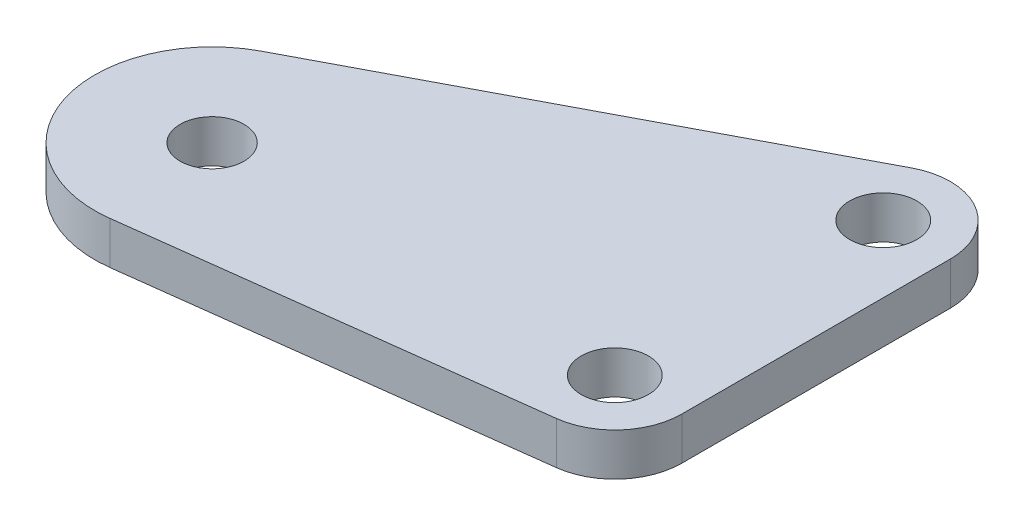
ISO-10303-21;
HEADER;
FILE_DESCRIPTION(('STEP AP214'),'2;1');
FILE_NAME('part.step','',(''),(''),'','','');
FILE_SCHEMA(('AUTOMOTIVE_DESIGN { 1 0 10303 214 1 1 1 1 }'));
ENDSEC;
DATA;
#1=APPLICATION_CONTEXT('core data for automotive mechanical design processes');
#2=APPLICATION_PROTOCOL_DEFINITION('international standard','automotive_design',2000,#1);
#3=PRODUCT_CONTEXT('',#1,'mechanical');
#4=PRODUCT('Part','Part','',(#3));
#5=PRODUCT_RELATED_PRODUCT_CATEGORY('part','',(#4));
#6=PRODUCT_DEFINITION_FORMATION('','',#4);
#7=PRODUCT_DEFINITION_CONTEXT('part definition',#1,'design');
#8=PRODUCT_DEFINITION('design','',#6,#7);
#9=PRODUCT_DEFINITION_SHAPE('','',#8);
#10=(LENGTH_UNIT() NAMED_UNIT(*) SI_UNIT(.MILLI.,.METRE.));
#11=(NAMED_UNIT(*) PLANE_ANGLE_UNIT() SI_UNIT($,.RADIAN.));
#12=(NAMED_UNIT(*) SI_UNIT($,.STERADIAN.) SOLID_ANGLE_UNIT());
#13=UNCERTAINTY_MEASURE_WITH_UNIT(LENGTH_MEASURE(1.E-05),#10,'distance_accuracy_value','');
#14=(GEOMETRIC_REPRESENTATION_CONTEXT(3) GLOBAL_UNCERTAINTY_ASSIGNED_CONTEXT((#13)) GLOBAL_UNIT_ASSIGNED_CONTEXT((#10,
#11,#12)) REPRESENTATION_CONTEXT('',''));
#15=CARTESIAN_POINT('',(0.,0.,0.));
#16=DIRECTION('',(0.,0.,1.));
#17=DIRECTION('',(1.,0.,0.));
#18=AXIS2_PLACEMENT_3D('',#15,#16,#17);
#19=CARTESIAN_POINT('',(0.,-6.35,-40.));
#20=DIRECTION('',(0.,1.,0.));
#21=DIRECTION('',(0.,0.,1.));
#22=AXIS2_PLACEMENT_3D('',#19,#20,#21);
#23=CYLINDRICAL_SURFACE('',#22,10.);
#24=CARTESIAN_POINT('',(0.,0.,-40.));
#25=DIRECTION('',(0.,1.,0.));
#26=DIRECTION('',(0.,0.,-1.));
#27=AXIS2_PLACEMENT_3D('',#24,#25,#26);
#28=CIRCLE('',#27,10.);
#29=CARTESIAN_POINT('',(10.,0.,-40.));
#30=VERTEX_POINT('',#29);
#31=CARTESIAN_POINT('',(-4.65153395683887,0.,-48.8523009352583));
#32=VERTEX_POINT('',#31);
#33=EDGE_CURVE('E130',#30,#32,#28,.T.);
#34=ORIENTED_EDGE('',*,*,#33,.F.);
#35=DIRECTION('',(0.,1.,0.));
#36=VECTOR('',#35,1.);
#37=CARTESIAN_POINT('',(10.,-6.35,-40.));
#38=LINE('',#37,#36);
#39=CARTESIAN_POINT('',(10.,-6.35,-40.));
#40=VERTEX_POINT('',#39);
#41=EDGE_CURVE('E11',#40,#30,#38,.T.);
#42=ORIENTED_EDGE('',*,*,#41,.F.);
#43=CARTESIAN_POINT('',(0.,-6.35,-40.));
#44=DIRECTION('',(0.,1.,0.));
#45=DIRECTION('',(0.,0.,-1.));
#46=AXIS2_PLACEMENT_3D('',#43,#44,#45);
#47=CIRCLE('',#46,10.);
#48=CARTESIAN_POINT('',(-4.65153395683887,-6.35,-48.8523009352583));
#49=VERTEX_POINT('',#48);
#50=EDGE_CURVE('E151',#40,#49,#47,.T.);
#51=ORIENTED_EDGE('',*,*,#50,.T.);
#52=DIRECTION('',(0.,1.,0.));
#53=VECTOR('',#52,1.);
#54=CARTESIAN_POINT('',(-4.65153395683887,-6.35,-48.8523009352583));
#55=LINE('',#54,#53);
#56=EDGE_CURVE('E42',#49,#32,#55,.T.);
#57=ORIENTED_EDGE('',*,*,#56,.T.);
#58=EDGE_LOOP('',(#34,#42,#51,#57));
#59=FACE_BOUND('',#58,.T.);
#60=ADVANCED_FACE('F39',(#59),#23,.T.);
#61=CARTESIAN_POINT('',(10.,-6.35,-40.));
#62=DIRECTION('',(1.,0.,0.));
#63=DIRECTION('',(0.,0.,-1.));
#64=AXIS2_PLACEMENT_3D('',#61,#62,#63);
#65=PLANE('',#64);
#66=DIRECTION('',(0.,0.,-1.));
#67=VECTOR('',#66,1.);
#68=CARTESIAN_POINT('',(10.,0.,-40.));
#69=LINE('',#68,#67);
#70=CARTESIAN_POINT('',(10.,0.,0.));
#71=VERTEX_POINT('',#70);
#72=EDGE_CURVE('E148',#71,#30,#69,.T.);
#73=ORIENTED_EDGE('',*,*,#72,.F.);
#74=DIRECTION('',(0.,1.,0.));
#75=VECTOR('',#74,1.);
#76=CARTESIAN_POINT('',(10.,-6.35,0.));
#77=LINE('',#76,#75);
#78=CARTESIAN_POINT('',(10.,-6.35,0.));
#79=VERTEX_POINT('',#78);
#80=EDGE_CURVE('E49',#79,#71,#77,.T.);
#81=ORIENTED_EDGE('',*,*,#80,.F.);
#82=DIRECTION('',(0.,0.,-1.));
#83=VECTOR('',#82,1.);
#84=CARTESIAN_POINT('',(10.,-6.35,-40.));
#85=LINE('',#84,#83);
#86=EDGE_CURVE('E116',#79,#40,#85,.T.);
#87=ORIENTED_EDGE('',*,*,#86,.T.);
#88=ORIENTED_EDGE('',*,*,#41,.T.);
#89=EDGE_LOOP('',(#73,#81,#87,#88));
#90=FACE_BOUND('',#89,.T.);
#91=ADVANCED_FACE('F163',(#90),#65,.T.);
#92=CARTESIAN_POINT('',(0.,-6.35,0.));
#93=DIRECTION('',(0.,1.,0.));
#94=DIRECTION('',(0.,0.,1.));
#95=AXIS2_PLACEMENT_3D('',#92,#93,#94);
#96=CYLINDRICAL_SURFACE('',#95,10.);
#97=CARTESIAN_POINT('',(0.,0.,0.));
#98=DIRECTION('',(0.,1.,0.));
#99=DIRECTION('',(0.,0.,-1.));
#100=AXIS2_PLACEMENT_3D('',#97,#98,#99);
#101=CIRCLE('',#100,10.);
#102=CARTESIAN_POINT('',(1.25,0.,9.92156741649221));
#103=VERTEX_POINT('',#102);
#104=EDGE_CURVE('E102',#103,#71,#101,.T.);
#105=ORIENTED_EDGE('',*,*,#104,.F.);
#106=DIRECTION('',(0.,1.,0.));
#107=VECTOR('',#106,1.);
#108=CARTESIAN_POINT('',(1.25,-6.35,9.92156741649221));
#109=LINE('',#108,#107);
#110=CARTESIAN_POINT('',(1.25,-6.35,9.92156741649221));
#111=VERTEX_POINT('',#110);
#112=EDGE_CURVE('E97',#111,#103,#109,.T.);
#113=ORIENTED_EDGE('',*,*,#112,.F.);
#114=CARTESIAN_POINT('',(0.,-6.35,0.));
#115=DIRECTION('',(0.,1.,0.));
#116=DIRECTION('',(0.,0.,-1.));
#117=AXIS2_PLACEMENT_3D('',#114,#115,#116);
#118=CIRCLE('',#117,10.);
#119=EDGE_CURVE('E100',#111,#79,#118,.T.);
#120=ORIENTED_EDGE('',*,*,#119,.T.);
#121=ORIENTED_EDGE('',*,*,#80,.T.);
#122=EDGE_LOOP('',(#105,#113,#120,#121));
#123=FACE_BOUND('',#122,.T.);
#124=ADVANCED_FACE('F99',(#123),#96,.T.);
#125=CARTESIAN_POINT('',(-57.8125,-6.35,17.3627429788614));
#126=DIRECTION('',(0.125,0.,0.992156741649221));
#127=DIRECTION('',(0.992156741649222,0.,-0.125));
#128=AXIS2_PLACEMENT_3D('',#125,#126,#127);
#129=PLANE('',#128);
#130=DIRECTION('',(0.992156741649222,0.,-0.125));
#131=VECTOR('',#130,1.);
#132=CARTESIAN_POINT('',(-57.8125,0.,17.3627429788614));
#133=LINE('',#132,#131);
#134=CARTESIAN_POINT('',(-57.8125,0.,17.3627429788614));
#135=VERTEX_POINT('',#134);
#136=EDGE_CURVE('E143',#135,#103,#133,.T.);
#137=ORIENTED_EDGE('',*,*,#136,.F.);
#138=DIRECTION('',(0.,1.,0.));
#139=VECTOR('',#138,1.);
#140=CARTESIAN_POINT('',(-57.8125,-6.35,17.3627429788614));
#141=LINE('',#140,#139);
#142=CARTESIAN_POINT('',(-57.8125,-6.35,17.3627429788614));
#143=VERTEX_POINT('',#142);
#144=EDGE_CURVE('E108',#143,#135,#141,.T.);
#145=ORIENTED_EDGE('',*,*,#144,.F.);
#146=DIRECTION('',(0.992156741649222,0.,-0.125));
#147=VECTOR('',#146,1.);
#148=CARTESIAN_POINT('',(-57.8125,-6.35,17.3627429788614));
#149=LINE('',#148,#147);
#150=EDGE_CURVE('E114',#143,#111,#149,.T.);
#151=ORIENTED_EDGE('',*,*,#150,.T.);
#152=ORIENTED_EDGE('',*,*,#112,.T.);
#153=EDGE_LOOP('',(#137,#145,#151,#152));
#154=FACE_BOUND('',#153,.T.);
#155=ADVANCED_FACE('F119',(#154),#129,.T.);
#156=CARTESIAN_POINT('',(-60.,-6.35,0.));
#157=DIRECTION('',(0.,1.,0.));
#158=DIRECTION('',(0.,0.,1.));
#159=AXIS2_PLACEMENT_3D('',#156,#157,#158);
#160=CYLINDRICAL_SURFACE('',#159,17.5);
#161=CARTESIAN_POINT('',(-60.,0.,0.));
#162=DIRECTION('',(0.,1.,0.));
#163=DIRECTION('',(0.,0.,1.));
#164=AXIS2_PLACEMENT_3D('',#161,#162,#163);
#165=CIRCLE('',#164,17.5);
#166=CARTESIAN_POINT('',(-68.140184424468,0.,-15.491526636702));
#167=VERTEX_POINT('',#166);
#168=EDGE_CURVE('E139',#167,#135,#165,.T.);
#169=ORIENTED_EDGE('',*,*,#168,.F.);
#170=DIRECTION('',(0.,1.,0.));
#171=VECTOR('',#170,1.);
#172=CARTESIAN_POINT('',(-68.140184424468,-6.35,-15.491526636702));
#173=LINE('',#172,#171);
#174=CARTESIAN_POINT('',(-68.140184424468,-6.35,-15.491526636702));
#175=VERTEX_POINT('',#174);
#176=EDGE_CURVE('E156',#175,#167,#173,.T.);
#177=ORIENTED_EDGE('',*,*,#176,.F.);
#178=CARTESIAN_POINT('',(-60.,-6.35,0.));
#179=DIRECTION('',(0.,1.,0.));
#180=DIRECTION('',(0.,0.,1.));
#181=AXIS2_PLACEMENT_3D('',#178,#179,#180);
#182=CIRCLE('',#181,17.5);
#183=EDGE_CURVE('E121',#175,#143,#182,.T.);
#184=ORIENTED_EDGE('',*,*,#183,.T.);
#185=ORIENTED_EDGE('',*,*,#144,.T.);
#186=EDGE_LOOP('',(#169,#177,#184,#185));
#187=FACE_BOUND('',#186,.T.);
#188=ADVANCED_FACE('F176',(#187),#160,.T.);
#189=CARTESIAN_POINT('',(-68.140184424468,-6.35,-15.491526636702));
#190=DIRECTION('',(-0.465153395683887,0.,-0.88523009352583));
#191=DIRECTION('',(-0.88523009352583,0.,0.465153395683887));
#192=AXIS2_PLACEMENT_3D('',#189,#190,#191);
#193=PLANE('',#192);
#194=DIRECTION('',(-0.88523009352583,0.,0.465153395683887));
#195=VECTOR('',#194,1.);
#196=CARTESIAN_POINT('',(-68.140184424468,0.,-15.491526636702));
#197=LINE('',#196,#195);
#198=EDGE_CURVE('E134',#32,#167,#197,.T.);
#199=ORIENTED_EDGE('',*,*,#198,.F.);
#200=ORIENTED_EDGE('',*,*,#56,.F.);
#201=DIRECTION('',(-0.88523009352583,0.,0.465153395683887));
#202=VECTOR('',#201,1.);
#203=CARTESIAN_POINT('',(-68.140184424468,-6.35,-15.491526636702));
#204=LINE('',#203,#202);
#205=EDGE_CURVE('E124',#49,#175,#204,.T.);
#206=ORIENTED_EDGE('',*,*,#205,.T.);
#207=ORIENTED_EDGE('',*,*,#176,.T.);
#208=EDGE_LOOP('',(#199,#200,#206,#207));
#209=FACE_BOUND('',#208,.T.);
#210=ADVANCED_FACE('F160',(#209),#193,.T.);
#211=CARTESIAN_POINT('',(0.,-6.35,-40.));
#212=DIRECTION('',(0.,-1.,0.));
#213=DIRECTION('',(0.,0.,-1.));
#214=AXIS2_PLACEMENT_3D('',#211,#212,#213);
#215=PLANE('',#214);
#216=CARTESIAN_POINT('',(-60.,-6.35,0.));
#217=DIRECTION('',(0.,1.,0.));
#218=DIRECTION('',(0.,0.,1.));
#219=AXIS2_PLACEMENT_3D('',#216,#217,#218);
#220=CIRCLE('',#219,4.7625);
#221=CARTESIAN_POINT('',(-60.,-6.35,4.76250000000001));
#222=VERTEX_POINT('',#221);
#223=EDGE_CURVE('E206',#222,#222,#220,.T.);
#224=ORIENTED_EDGE('',*,*,#223,.T.);
#225=EDGE_LOOP('',(#224));
#226=FACE_BOUND('',#225,.T.);
#227=CARTESIAN_POINT('',(0.,-6.35,-40.));
#228=DIRECTION('',(0.,1.,0.));
#229=DIRECTION('',(0.,0.,1.));
#230=AXIS2_PLACEMENT_3D('',#227,#228,#229);
#231=CIRCLE('',#230,5.);
#232=CARTESIAN_POINT('',(0.,-6.35,-35.));
#233=VERTEX_POINT('',#232);
#234=EDGE_CURVE('E216',#233,#233,#231,.T.);
#235=ORIENTED_EDGE('',*,*,#234,.T.);
#236=EDGE_LOOP('',(#235));
#237=FACE_BOUND('',#236,.T.);
#238=CARTESIAN_POINT('',(0.,-6.35,0.));
#239=DIRECTION('',(0.,1.,0.));
#240=DIRECTION('',(0.,0.,1.));
#241=AXIS2_PLACEMENT_3D('',#238,#239,#240);
#242=CIRCLE('',#241,5.);
#243=CARTESIAN_POINT('',(0.,-6.35,5.));
#244=VERTEX_POINT('',#243);
#245=EDGE_CURVE('E135',#244,#244,#242,.T.);
#246=ORIENTED_EDGE('',*,*,#245,.T.);
#247=EDGE_LOOP('',(#246));
#248=FACE_BOUND('',#247,.T.);
#249=ORIENTED_EDGE('',*,*,#50,.F.);
#250=ORIENTED_EDGE('',*,*,#86,.F.);
#251=ORIENTED_EDGE('',*,*,#119,.F.);
#252=ORIENTED_EDGE('',*,*,#150,.F.);
#253=ORIENTED_EDGE('',*,*,#183,.F.);
#254=ORIENTED_EDGE('',*,*,#205,.F.);
#255=EDGE_LOOP('',(#249,#250,#251,#252,#253,#254));
#256=FACE_BOUND('',#255,.T.);
#257=ADVANCED_FACE('F112',(#226,#237,#248,#256),#215,.T.);
#258=CARTESIAN_POINT('',(0.,0.,-40.));
#259=DIRECTION('',(0.,-1.,0.));
#260=DIRECTION('',(0.,0.,-1.));
#261=AXIS2_PLACEMENT_3D('',#258,#259,#260);
#262=PLANE('',#261);
#263=CARTESIAN_POINT('',(-60.,0.,0.));
#264=DIRECTION('',(0.,1.,0.));
#265=DIRECTION('',(0.,0.,1.));
#266=AXIS2_PLACEMENT_3D('',#263,#264,#265);
#267=CIRCLE('',#266,4.7625);
#268=CARTESIAN_POINT('',(-60.,0.,4.76250000000001));
#269=VERTEX_POINT('',#268);
#270=EDGE_CURVE('E209',#269,#269,#267,.T.);
#271=ORIENTED_EDGE('',*,*,#270,.F.);
#272=EDGE_LOOP('',(#271));
#273=FACE_BOUND('',#272,.T.);
#274=CARTESIAN_POINT('',(0.,0.,-40.));
#275=DIRECTION('',(0.,1.,0.));
#276=DIRECTION('',(0.,0.,1.));
#277=AXIS2_PLACEMENT_3D('',#274,#275,#276);
#278=CIRCLE('',#277,5.);
#279=CARTESIAN_POINT('',(0.,0.,-35.));
#280=VERTEX_POINT('',#279);
#281=EDGE_CURVE('E213',#280,#280,#278,.T.);
#282=ORIENTED_EDGE('',*,*,#281,.F.);
#283=EDGE_LOOP('',(#282));
#284=FACE_BOUND('',#283,.T.);
#285=CARTESIAN_POINT('',(0.,0.,0.));
#286=DIRECTION('',(0.,1.,0.));
#287=DIRECTION('',(0.,0.,1.));
#288=AXIS2_PLACEMENT_3D('',#285,#286,#287);
#289=CIRCLE('',#288,5.);
#290=CARTESIAN_POINT('',(0.,0.,5.));
#291=VERTEX_POINT('',#290);
#292=EDGE_CURVE('E220',#291,#291,#289,.T.);
#293=ORIENTED_EDGE('',*,*,#292,.F.);
#294=EDGE_LOOP('',(#293));
#295=FACE_BOUND('',#294,.T.);
#296=ORIENTED_EDGE('',*,*,#33,.T.);
#297=ORIENTED_EDGE('',*,*,#198,.T.);
#298=ORIENTED_EDGE('',*,*,#168,.T.);
#299=ORIENTED_EDGE('',*,*,#136,.T.);
#300=ORIENTED_EDGE('',*,*,#104,.T.);
#301=ORIENTED_EDGE('',*,*,#72,.T.);
#302=EDGE_LOOP('',(#296,#297,#298,#299,#300,#301));
#303=FACE_BOUND('',#302,.T.);
#304=ADVANCED_FACE('F162',(#273,#284,#295,#303),#262,.F.);
#305=CARTESIAN_POINT('',(0.,-6.35,0.));
#306=DIRECTION('',(0.,1.,0.));
#307=DIRECTION('',(0.,0.,1.));
#308=AXIS2_PLACEMENT_3D('',#305,#306,#307);
#309=CYLINDRICAL_SURFACE('',#308,5.);
#310=ORIENTED_EDGE('',*,*,#245,.F.);
#311=EDGE_LOOP('',(#310));
#312=FACE_BOUND('',#311,.T.);
#313=ORIENTED_EDGE('',*,*,#292,.T.);
#314=EDGE_LOOP('',(#313));
#315=FACE_BOUND('',#314,.T.);
#316=ADVANCED_FACE('F187',(#312,#315),#309,.F.);
#317=CARTESIAN_POINT('',(0.,-6.35,-40.));
#318=DIRECTION('',(0.,1.,0.));
#319=DIRECTION('',(0.,0.,1.));
#320=AXIS2_PLACEMENT_3D('',#317,#318,#319);
#321=CYLINDRICAL_SURFACE('',#320,5.);
#322=ORIENTED_EDGE('',*,*,#234,.F.);
#323=EDGE_LOOP('',(#322));
#324=FACE_BOUND('',#323,.T.);
#325=ORIENTED_EDGE('',*,*,#281,.T.);
#326=EDGE_LOOP('',(#325));
#327=FACE_BOUND('',#326,.T.);
#328=ADVANCED_FACE('F194',(#324,#327),#321,.F.);
#329=CARTESIAN_POINT('',(-60.,-6.35,0.));
#330=DIRECTION('',(0.,1.,0.));
#331=DIRECTION('',(0.,0.,1.));
#332=AXIS2_PLACEMENT_3D('',#329,#330,#331);
#333=CYLINDRICAL_SURFACE('',#332,4.7625);
#334=ORIENTED_EDGE('',*,*,#223,.F.);
#335=EDGE_LOOP('',(#334));
#336=FACE_BOUND('',#335,.T.);
#337=ORIENTED_EDGE('',*,*,#270,.T.);
#338=EDGE_LOOP('',(#337));
#339=FACE_BOUND('',#338,.T.);
#340=ADVANCED_FACE('F198',(#336,#339),#333,.F.);
#341=CLOSED_SHELL('',(#60,#91,#124,#155,#188,#210,#257,#304,#316,#328,#340));
#342=MANIFOLD_SOLID_BREP('B2',#341);
#343=ADVANCED_BREP_SHAPE_REPRESENTATION('',(#18,#342),#14);
#344=SHAPE_DEFINITION_REPRESENTATION(#9,#343);
ENDSEC;
END-ISO-10303-21;
